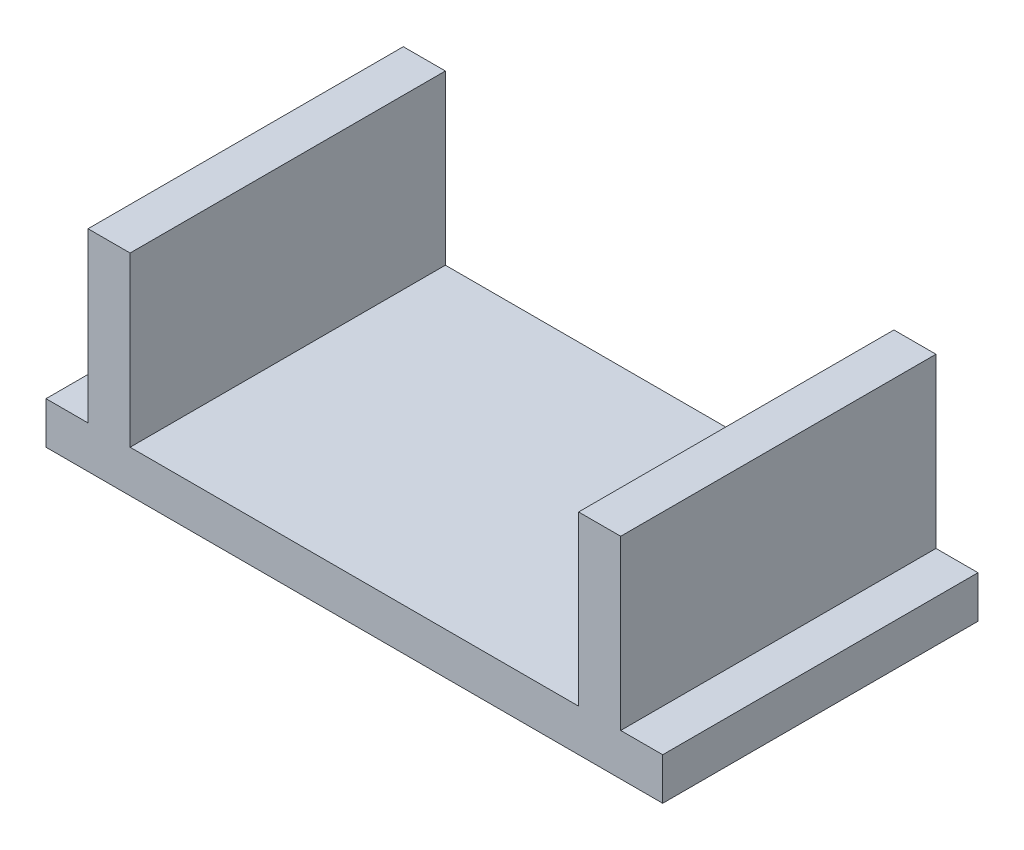
ISO-10303-21;
HEADER;
FILE_DESCRIPTION(('STEP AP214'),'2;1');
FILE_NAME('part.step','',(''),(''),'','','');
FILE_SCHEMA(('AUTOMOTIVE_DESIGN { 1 0 10303 214 1 1 1 1 }'));
ENDSEC;
DATA;
#1=APPLICATION_CONTEXT('core data for automotive mechanical design processes');
#2=APPLICATION_PROTOCOL_DEFINITION('international standard','automotive_design',2000,#1);
#3=PRODUCT_CONTEXT('',#1,'mechanical');
#4=PRODUCT('Part','Part','',(#3));
#5=PRODUCT_RELATED_PRODUCT_CATEGORY('part','',(#4));
#6=PRODUCT_DEFINITION_FORMATION('','',#4);
#7=PRODUCT_DEFINITION_CONTEXT('part definition',#1,'design');
#8=PRODUCT_DEFINITION('design','',#6,#7);
#9=PRODUCT_DEFINITION_SHAPE('','',#8);
#10=(LENGTH_UNIT() NAMED_UNIT(*) SI_UNIT(.MILLI.,.METRE.));
#11=(NAMED_UNIT(*) PLANE_ANGLE_UNIT() SI_UNIT($,.RADIAN.));
#12=(NAMED_UNIT(*) SI_UNIT($,.STERADIAN.) SOLID_ANGLE_UNIT());
#13=UNCERTAINTY_MEASURE_WITH_UNIT(LENGTH_MEASURE(1.E-05),#10,'distance_accuracy_value','');
#14=(GEOMETRIC_REPRESENTATION_CONTEXT(3) GLOBAL_UNCERTAINTY_ASSIGNED_CONTEXT((#13)) GLOBAL_UNIT_ASSIGNED_CONTEXT((#10,
#11,#12)) REPRESENTATION_CONTEXT('',''));
#15=CARTESIAN_POINT('',(0.,0.,0.));
#16=DIRECTION('',(0.,0.,1.));
#17=DIRECTION('',(1.,0.,0.));
#18=AXIS2_PLACEMENT_3D('',#15,#16,#17);
#19=CARTESIAN_POINT('',(-69.85,9.53,35.71));
#20=DIRECTION('',(0.,-1.,0.));
#21=DIRECTION('',(0.,0.,-1.));
#22=AXIS2_PLACEMENT_3D('',#19,#20,#21);
#23=PLANE('',#22);
#24=DIRECTION('',(0.,0.,-1.));
#25=VECTOR('',#24,1.);
#26=CARTESIAN_POINT('',(50.8,9.53,35.71));
#27=LINE('',#26,#25);
#28=CARTESIAN_POINT('',(50.8,9.53,35.71));
#29=VERTEX_POINT('',#28);
#30=CARTESIAN_POINT('',(50.8,9.53,-35.71));
#31=VERTEX_POINT('',#30);
#32=EDGE_CURVE('E163',#29,#31,#27,.T.);
#33=ORIENTED_EDGE('',*,*,#32,.T.);
#34=DIRECTION('',(-1.,0.,0.));
#35=VECTOR('',#34,1.);
#36=CARTESIAN_POINT('',(-69.85,9.53,-35.71));
#37=LINE('',#36,#35);
#38=CARTESIAN_POINT('',(-50.8,9.53,-35.71));
#39=VERTEX_POINT('',#38);
#40=EDGE_CURVE('E208',#31,#39,#37,.T.);
#41=ORIENTED_EDGE('',*,*,#40,.T.);
#42=DIRECTION('',(0.,0.,-1.));
#43=VECTOR('',#42,1.);
#44=CARTESIAN_POINT('',(-50.8,9.53,35.71));
#45=LINE('',#44,#43);
#46=CARTESIAN_POINT('',(-50.8,9.53,35.71));
#47=VERTEX_POINT('',#46);
#48=EDGE_CURVE('E183',#47,#39,#45,.T.);
#49=ORIENTED_EDGE('',*,*,#48,.F.);
#50=DIRECTION('',(-1.,0.,0.));
#51=VECTOR('',#50,1.);
#52=CARTESIAN_POINT('',(-69.85,9.53,35.71));
#53=LINE('',#52,#51);
#54=EDGE_CURVE('E54',#29,#47,#53,.T.);
#55=ORIENTED_EDGE('',*,*,#54,.F.);
#56=EDGE_LOOP('',(#33,#41,#49,#55));
#57=FACE_BOUND('',#56,.T.);
#58=ADVANCED_FACE('F39',(#57),#23,.F.);
#59=DIRECTION('',(0.,0.,-1.));
#60=VECTOR('',#59,1.);
#61=CARTESIAN_POINT('',(60.33,9.53,35.71));
#62=LINE('',#61,#60);
#63=CARTESIAN_POINT('',(60.33,9.53,35.71));
#64=VERTEX_POINT('',#63);
#65=CARTESIAN_POINT('',(60.33,9.53,-35.71));
#66=VERTEX_POINT('',#65);
#67=EDGE_CURVE('E62',#64,#66,#62,.T.);
#68=ORIENTED_EDGE('',*,*,#67,.F.);
#69=CARTESIAN_POINT('',(69.85,9.53,35.71));
#70=VERTEX_POINT('',#69);
#71=EDGE_CURVE('E136',#70,#64,#53,.T.);
#72=ORIENTED_EDGE('',*,*,#71,.F.);
#73=DIRECTION('',(0.,0.,-1.));
#74=VECTOR('',#73,1.);
#75=CARTESIAN_POINT('',(69.85,9.53,35.71));
#76=LINE('',#75,#74);
#77=CARTESIAN_POINT('',(69.85,9.53,-35.71));
#78=VERTEX_POINT('',#77);
#79=EDGE_CURVE('E211',#70,#78,#76,.T.);
#80=ORIENTED_EDGE('',*,*,#79,.T.);
#81=EDGE_CURVE('E193',#78,#66,#37,.T.);
#82=ORIENTED_EDGE('',*,*,#81,.T.);
#83=EDGE_LOOP('',(#68,#72,#80,#82));
#84=FACE_BOUND('',#83,.T.);
#85=ADVANCED_FACE('F225',(#84),#23,.F.);
#86=CARTESIAN_POINT('',(-69.85,0.,35.71));
#87=DIRECTION('',(1.,0.,0.));
#88=DIRECTION('',(0.,0.,-1.));
#89=AXIS2_PLACEMENT_3D('',#86,#87,#88);
#90=PLANE('',#89);
#91=DIRECTION('',(0.,-1.,0.));
#92=VECTOR('',#91,1.);
#93=CARTESIAN_POINT('',(-69.85,0.,-35.71));
#94=LINE('',#93,#92);
#95=CARTESIAN_POINT('',(-69.85,9.53,-35.71));
#96=VERTEX_POINT('',#95);
#97=CARTESIAN_POINT('',(-69.85,0.,-35.71));
#98=VERTEX_POINT('',#97);
#99=EDGE_CURVE('E189',#96,#98,#94,.T.);
#100=ORIENTED_EDGE('',*,*,#99,.T.);
#101=DIRECTION('',(0.,0.,-1.));
#102=VECTOR('',#101,1.);
#103=CARTESIAN_POINT('',(-69.85,0.,35.71));
#104=LINE('',#103,#102);
#105=CARTESIAN_POINT('',(-69.85,0.,35.71));
#106=VERTEX_POINT('',#105);
#107=EDGE_CURVE('E11',#106,#98,#104,.T.);
#108=ORIENTED_EDGE('',*,*,#107,.F.);
#109=DIRECTION('',(0.,-1.,0.));
#110=VECTOR('',#109,1.);
#111=CARTESIAN_POINT('',(-69.85,0.,35.71));
#112=LINE('',#111,#110);
#113=CARTESIAN_POINT('',(-69.85,9.53,35.71));
#114=VERTEX_POINT('',#113);
#115=EDGE_CURVE('E190',#114,#106,#112,.T.);
#116=ORIENTED_EDGE('',*,*,#115,.F.);
#117=DIRECTION('',(0.,0.,-1.));
#118=VECTOR('',#117,1.);
#119=CARTESIAN_POINT('',(-69.85,9.53,35.71));
#120=LINE('',#119,#118);
#121=EDGE_CURVE('E199',#114,#96,#120,.T.);
#122=ORIENTED_EDGE('',*,*,#121,.T.);
#123=EDGE_LOOP('',(#100,#108,#116,#122));
#124=FACE_BOUND('',#123,.T.);
#125=ADVANCED_FACE('F41',(#124),#90,.F.);
#126=CARTESIAN_POINT('',(-69.85,0.,35.71));
#127=DIRECTION('',(0.,1.,0.));
#128=DIRECTION('',(0.,0.,1.));
#129=AXIS2_PLACEMENT_3D('',#126,#127,#128);
#130=PLANE('',#129);
#131=DIRECTION('',(1.,0.,0.));
#132=VECTOR('',#131,1.);
#133=CARTESIAN_POINT('',(-69.85,0.,-35.71));
#134=LINE('',#133,#132);
#135=CARTESIAN_POINT('',(69.85,0.,-35.71));
#136=VERTEX_POINT('',#135);
#137=EDGE_CURVE('E202',#98,#136,#134,.T.);
#138=ORIENTED_EDGE('',*,*,#137,.T.);
#139=DIRECTION('',(0.,0.,-1.));
#140=VECTOR('',#139,1.);
#141=CARTESIAN_POINT('',(69.85,0.,35.71));
#142=LINE('',#141,#140);
#143=CARTESIAN_POINT('',(69.85,0.,35.71));
#144=VERTEX_POINT('',#143);
#145=EDGE_CURVE('E47',#144,#136,#142,.T.);
#146=ORIENTED_EDGE('',*,*,#145,.F.);
#147=DIRECTION('',(1.,0.,0.));
#148=VECTOR('',#147,1.);
#149=CARTESIAN_POINT('',(-69.85,0.,35.71));
#150=LINE('',#149,#148);
#151=EDGE_CURVE('E192',#106,#144,#150,.T.);
#152=ORIENTED_EDGE('',*,*,#151,.F.);
#153=ORIENTED_EDGE('',*,*,#107,.T.);
#154=EDGE_LOOP('',(#138,#146,#152,#153));
#155=FACE_BOUND('',#154,.T.);
#156=ADVANCED_FACE('F234',(#155),#130,.F.);
#157=CARTESIAN_POINT('',(69.85,0.,35.71));
#158=DIRECTION('',(-1.,0.,0.));
#159=DIRECTION('',(0.,0.,1.));
#160=AXIS2_PLACEMENT_3D('',#157,#158,#159);
#161=PLANE('',#160);
#162=DIRECTION('',(0.,1.,0.));
#163=VECTOR('',#162,1.);
#164=CARTESIAN_POINT('',(69.85,0.,-35.71));
#165=LINE('',#164,#163);
#166=EDGE_CURVE('E204',#136,#78,#165,.T.);
#167=ORIENTED_EDGE('',*,*,#166,.T.);
#168=ORIENTED_EDGE('',*,*,#79,.F.);
#169=DIRECTION('',(0.,1.,0.));
#170=VECTOR('',#169,1.);
#171=CARTESIAN_POINT('',(69.85,0.,35.71));
#172=LINE('',#171,#170);
#173=EDGE_CURVE('E195',#144,#70,#172,.T.);
#174=ORIENTED_EDGE('',*,*,#173,.F.);
#175=ORIENTED_EDGE('',*,*,#145,.T.);
#176=EDGE_LOOP('',(#167,#168,#174,#175));
#177=FACE_BOUND('',#176,.T.);
#178=ADVANCED_FACE('F218',(#177),#161,.F.);
#179=CARTESIAN_POINT('',(-60.33,9.53,35.71));
#180=VERTEX_POINT('',#179);
#181=EDGE_CURVE('E197',#180,#114,#53,.T.);
#182=ORIENTED_EDGE('',*,*,#181,.F.);
#183=DIRECTION('',(0.,0.,-1.));
#184=VECTOR('',#183,1.);
#185=CARTESIAN_POINT('',(-60.33,9.53,35.71));
#186=LINE('',#185,#184);
#187=CARTESIAN_POINT('',(-60.33,9.53,-35.71));
#188=VERTEX_POINT('',#187);
#189=EDGE_CURVE('E186',#180,#188,#186,.T.);
#190=ORIENTED_EDGE('',*,*,#189,.T.);
#191=EDGE_CURVE('E206',#188,#96,#37,.T.);
#192=ORIENTED_EDGE('',*,*,#191,.T.);
#193=ORIENTED_EDGE('',*,*,#121,.F.);
#194=EDGE_LOOP('',(#182,#190,#192,#193));
#195=FACE_BOUND('',#194,.T.);
#196=ADVANCED_FACE('F228',(#195),#23,.F.);
#197=CARTESIAN_POINT('',(0.,0.,35.71));
#198=DIRECTION('',(0.,0.,-1.));
#199=DIRECTION('',(-1.,0.,0.));
#200=AXIS2_PLACEMENT_3D('',#197,#198,#199);
#201=PLANE('',#200);
#202=ORIENTED_EDGE('',*,*,#115,.T.);
#203=ORIENTED_EDGE('',*,*,#151,.T.);
#204=ORIENTED_EDGE('',*,*,#173,.T.);
#205=ORIENTED_EDGE('',*,*,#71,.T.);
#206=DIRECTION('',(0.,1.,0.));
#207=VECTOR('',#206,1.);
#208=CARTESIAN_POINT('',(60.33,9.53,35.71));
#209=LINE('',#208,#207);
#210=CARTESIAN_POINT('',(60.33,47.63,35.71));
#211=VERTEX_POINT('',#210);
#212=EDGE_CURVE('E129',#64,#211,#209,.T.);
#213=ORIENTED_EDGE('',*,*,#212,.T.);
#214=DIRECTION('',(-1.,0.,0.));
#215=VECTOR('',#214,1.);
#216=CARTESIAN_POINT('',(50.8,47.63,35.71));
#217=LINE('',#216,#215);
#218=CARTESIAN_POINT('',(50.8,47.63,35.71));
#219=VERTEX_POINT('',#218);
#220=EDGE_CURVE('E134',#211,#219,#217,.T.);
#221=ORIENTED_EDGE('',*,*,#220,.T.);
#222=DIRECTION('',(0.,-1.,0.));
#223=VECTOR('',#222,1.);
#224=CARTESIAN_POINT('',(50.8,9.53,35.71));
#225=LINE('',#224,#223);
#226=EDGE_CURVE('E138',#219,#29,#225,.T.);
#227=ORIENTED_EDGE('',*,*,#226,.T.);
#228=ORIENTED_EDGE('',*,*,#54,.T.);
#229=DIRECTION('',(0.,1.,0.));
#230=VECTOR('',#229,1.);
#231=CARTESIAN_POINT('',(-50.8,9.53,35.71));
#232=LINE('',#231,#230);
#233=CARTESIAN_POINT('',(-50.8,47.63,35.71));
#234=VERTEX_POINT('',#233);
#235=EDGE_CURVE('E168',#47,#234,#232,.T.);
#236=ORIENTED_EDGE('',*,*,#235,.T.);
#237=DIRECTION('',(-1.,0.,0.));
#238=VECTOR('',#237,1.);
#239=CARTESIAN_POINT('',(-60.33,47.63,35.71));
#240=LINE('',#239,#238);
#241=CARTESIAN_POINT('',(-60.33,47.63,35.71));
#242=VERTEX_POINT('',#241);
#243=EDGE_CURVE('E171',#234,#242,#240,.T.);
#244=ORIENTED_EDGE('',*,*,#243,.T.);
#245=DIRECTION('',(0.,-1.,0.));
#246=VECTOR('',#245,1.);
#247=CARTESIAN_POINT('',(-60.33,9.53,35.71));
#248=LINE('',#247,#246);
#249=EDGE_CURVE('E166',#242,#180,#248,.T.);
#250=ORIENTED_EDGE('',*,*,#249,.T.);
#251=ORIENTED_EDGE('',*,*,#181,.T.);
#252=EDGE_LOOP('',(#202,#203,#204,#205,#213,#221,#227,#228,#236,#244,#250,#251));
#253=FACE_BOUND('',#252,.T.);
#254=ADVANCED_FACE('F132',(#253),#201,.F.);
#255=CARTESIAN_POINT('',(0.,0.,-35.71));
#256=DIRECTION('',(0.,0.,-1.));
#257=DIRECTION('',(-1.,0.,0.));
#258=AXIS2_PLACEMENT_3D('',#255,#256,#257);
#259=PLANE('',#258);
#260=ORIENTED_EDGE('',*,*,#99,.F.);
#261=ORIENTED_EDGE('',*,*,#191,.F.);
#262=DIRECTION('',(0.,-1.,0.));
#263=VECTOR('',#262,1.);
#264=CARTESIAN_POINT('',(-60.33,9.53,-35.71));
#265=LINE('',#264,#263);
#266=CARTESIAN_POINT('',(-60.33,47.63,-35.71));
#267=VERTEX_POINT('',#266);
#268=EDGE_CURVE('E165',#267,#188,#265,.T.);
#269=ORIENTED_EDGE('',*,*,#268,.F.);
#270=DIRECTION('',(-1.,0.,0.));
#271=VECTOR('',#270,1.);
#272=CARTESIAN_POINT('',(-60.33,47.63,-35.71));
#273=LINE('',#272,#271);
#274=CARTESIAN_POINT('',(-50.8,47.63,-35.71));
#275=VERTEX_POINT('',#274);
#276=EDGE_CURVE('E169',#275,#267,#273,.T.);
#277=ORIENTED_EDGE('',*,*,#276,.F.);
#278=DIRECTION('',(0.,1.,0.));
#279=VECTOR('',#278,1.);
#280=CARTESIAN_POINT('',(-50.8,9.53,-35.71));
#281=LINE('',#280,#279);
#282=EDGE_CURVE('E175',#39,#275,#281,.T.);
#283=ORIENTED_EDGE('',*,*,#282,.F.);
#284=ORIENTED_EDGE('',*,*,#40,.F.);
#285=DIRECTION('',(0.,-1.,0.));
#286=VECTOR('',#285,1.);
#287=CARTESIAN_POINT('',(50.8,9.53,-35.71));
#288=LINE('',#287,#286);
#289=CARTESIAN_POINT('',(50.8,47.63,-35.71));
#290=VERTEX_POINT('',#289);
#291=EDGE_CURVE('E156',#290,#31,#288,.T.);
#292=ORIENTED_EDGE('',*,*,#291,.F.);
#293=DIRECTION('',(-1.,0.,0.));
#294=VECTOR('',#293,1.);
#295=CARTESIAN_POINT('',(50.8,47.63,-35.71));
#296=LINE('',#295,#294);
#297=CARTESIAN_POINT('',(60.33,47.63,-35.71));
#298=VERTEX_POINT('',#297);
#299=EDGE_CURVE('E160',#298,#290,#296,.T.);
#300=ORIENTED_EDGE('',*,*,#299,.F.);
#301=DIRECTION('',(0.,1.,0.));
#302=VECTOR('',#301,1.);
#303=CARTESIAN_POINT('',(60.33,9.53,-35.71));
#304=LINE('',#303,#302);
#305=EDGE_CURVE('E144',#66,#298,#304,.T.);
#306=ORIENTED_EDGE('',*,*,#305,.F.);
#307=ORIENTED_EDGE('',*,*,#81,.F.);
#308=ORIENTED_EDGE('',*,*,#166,.F.);
#309=ORIENTED_EDGE('',*,*,#137,.F.);
#310=EDGE_LOOP('',(#260,#261,#269,#277,#283,#284,#292,#300,#306,#307,#308,#309));
#311=FACE_BOUND('',#310,.T.);
#312=ADVANCED_FACE('F224',(#311),#259,.T.);
#313=CARTESIAN_POINT('',(-60.33,9.53,35.71));
#314=DIRECTION('',(1.,0.,0.));
#315=DIRECTION('',(0.,0.,-1.));
#316=AXIS2_PLACEMENT_3D('',#313,#314,#315);
#317=PLANE('',#316);
#318=ORIENTED_EDGE('',*,*,#268,.T.);
#319=ORIENTED_EDGE('',*,*,#189,.F.);
#320=ORIENTED_EDGE('',*,*,#249,.F.);
#321=DIRECTION('',(0.,0.,-1.));
#322=VECTOR('',#321,1.);
#323=CARTESIAN_POINT('',(-60.33,47.63,35.71));
#324=LINE('',#323,#322);
#325=EDGE_CURVE('E173',#242,#267,#324,.T.);
#326=ORIENTED_EDGE('',*,*,#325,.T.);
#327=EDGE_LOOP('',(#318,#319,#320,#326));
#328=FACE_BOUND('',#327,.T.);
#329=ADVANCED_FACE('F293',(#328),#317,.F.);
#330=CARTESIAN_POINT('',(-50.8,9.53,35.71));
#331=DIRECTION('',(-1.,0.,0.));
#332=DIRECTION('',(0.,0.,1.));
#333=AXIS2_PLACEMENT_3D('',#330,#331,#332);
#334=PLANE('',#333);
#335=ORIENTED_EDGE('',*,*,#282,.T.);
#336=DIRECTION('',(0.,0.,-1.));
#337=VECTOR('',#336,1.);
#338=CARTESIAN_POINT('',(-50.8,47.63,35.71));
#339=LINE('',#338,#337);
#340=EDGE_CURVE('E180',#234,#275,#339,.T.);
#341=ORIENTED_EDGE('',*,*,#340,.F.);
#342=ORIENTED_EDGE('',*,*,#235,.F.);
#343=ORIENTED_EDGE('',*,*,#48,.T.);
#344=EDGE_LOOP('',(#335,#341,#342,#343));
#345=FACE_BOUND('',#344,.T.);
#346=ADVANCED_FACE('F254',(#345),#334,.F.);
#347=CARTESIAN_POINT('',(-60.33,47.63,35.71));
#348=DIRECTION('',(0.,-1.,0.));
#349=DIRECTION('',(0.,0.,-1.));
#350=AXIS2_PLACEMENT_3D('',#347,#348,#349);
#351=PLANE('',#350);
#352=ORIENTED_EDGE('',*,*,#276,.T.);
#353=ORIENTED_EDGE('',*,*,#325,.F.);
#354=ORIENTED_EDGE('',*,*,#243,.F.);
#355=ORIENTED_EDGE('',*,*,#340,.T.);
#356=EDGE_LOOP('',(#352,#353,#354,#355));
#357=FACE_BOUND('',#356,.T.);
#358=ADVANCED_FACE('F315',(#357),#351,.F.);
#359=CARTESIAN_POINT('',(50.8,9.53,35.71));
#360=DIRECTION('',(1.,0.,0.));
#361=DIRECTION('',(0.,0.,-1.));
#362=AXIS2_PLACEMENT_3D('',#359,#360,#361);
#363=PLANE('',#362);
#364=ORIENTED_EDGE('',*,*,#291,.T.);
#365=ORIENTED_EDGE('',*,*,#32,.F.);
#366=ORIENTED_EDGE('',*,*,#226,.F.);
#367=DIRECTION('',(0.,0.,-1.));
#368=VECTOR('',#367,1.);
#369=CARTESIAN_POINT('',(50.8,47.63,35.71));
#370=LINE('',#369,#368);
#371=EDGE_CURVE('E147',#219,#290,#370,.T.);
#372=ORIENTED_EDGE('',*,*,#371,.T.);
#373=EDGE_LOOP('',(#364,#365,#366,#372));
#374=FACE_BOUND('',#373,.T.);
#375=ADVANCED_FACE('F324',(#374),#363,.F.);
#376=CARTESIAN_POINT('',(60.33,9.53,35.71));
#377=DIRECTION('',(-1.,0.,0.));
#378=DIRECTION('',(0.,0.,1.));
#379=AXIS2_PLACEMENT_3D('',#376,#377,#378);
#380=PLANE('',#379);
#381=ORIENTED_EDGE('',*,*,#305,.T.);
#382=DIRECTION('',(0.,0.,-1.));
#383=VECTOR('',#382,1.);
#384=CARTESIAN_POINT('',(60.33,47.63,35.71));
#385=LINE('',#384,#383);
#386=EDGE_CURVE('E141',#211,#298,#385,.T.);
#387=ORIENTED_EDGE('',*,*,#386,.F.);
#388=ORIENTED_EDGE('',*,*,#212,.F.);
#389=ORIENTED_EDGE('',*,*,#67,.T.);
#390=EDGE_LOOP('',(#381,#387,#388,#389));
#391=FACE_BOUND('',#390,.T.);
#392=ADVANCED_FACE('F142',(#391),#380,.F.);
#393=CARTESIAN_POINT('',(50.8,47.63,35.71));
#394=DIRECTION('',(0.,-1.,0.));
#395=DIRECTION('',(0.,0.,-1.));
#396=AXIS2_PLACEMENT_3D('',#393,#394,#395);
#397=PLANE('',#396);
#398=ORIENTED_EDGE('',*,*,#299,.T.);
#399=ORIENTED_EDGE('',*,*,#371,.F.);
#400=ORIENTED_EDGE('',*,*,#220,.F.);
#401=ORIENTED_EDGE('',*,*,#386,.T.);
#402=EDGE_LOOP('',(#398,#399,#400,#401));
#403=FACE_BOUND('',#402,.T.);
#404=ADVANCED_FACE('F149',(#403),#397,.F.);
#405=CLOSED_SHELL('',(#58,#85,#125,#156,#178,#196,#254,#312,#329,#346,#358,#375,#392,#404));
#406=MANIFOLD_SOLID_BREP('B2',#405);
#407=ADVANCED_BREP_SHAPE_REPRESENTATION('',(#18,#406),#14);
#408=SHAPE_DEFINITION_REPRESENTATION(#9,#407);
ENDSEC;
END-ISO-10303-21;
